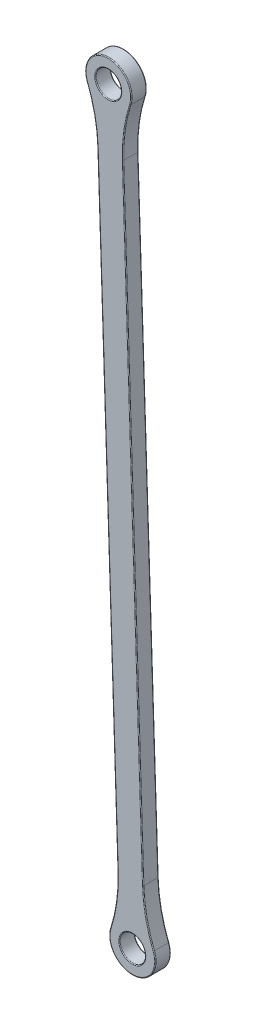
ISO-10303-21;
HEADER;
FILE_DESCRIPTION(('STEP AP214'),'2;1');
FILE_NAME('part.step','',(''),(''),'','','');
FILE_SCHEMA(('AUTOMOTIVE_DESIGN { 1 0 10303 214 1 1 1 1 }'));
ENDSEC;
DATA;
#1=APPLICATION_CONTEXT('core data for automotive mechanical design processes');
#2=APPLICATION_PROTOCOL_DEFINITION('international standard','automotive_design',2000,#1);
#3=PRODUCT_CONTEXT('',#1,'mechanical');
#4=PRODUCT('Part','Part','',(#3));
#5=PRODUCT_RELATED_PRODUCT_CATEGORY('part','',(#4));
#6=PRODUCT_DEFINITION_FORMATION('','',#4);
#7=PRODUCT_DEFINITION_CONTEXT('part definition',#1,'design');
#8=PRODUCT_DEFINITION('design','',#6,#7);
#9=PRODUCT_DEFINITION_SHAPE('','',#8);
#10=(LENGTH_UNIT() NAMED_UNIT(*) SI_UNIT(.MILLI.,.METRE.));
#11=(NAMED_UNIT(*) PLANE_ANGLE_UNIT() SI_UNIT($,.RADIAN.));
#12=(NAMED_UNIT(*) SI_UNIT($,.STERADIAN.) SOLID_ANGLE_UNIT());
#13=UNCERTAINTY_MEASURE_WITH_UNIT(LENGTH_MEASURE(1.E-05),#10,'distance_accuracy_value','');
#14=(GEOMETRIC_REPRESENTATION_CONTEXT(3) GLOBAL_UNCERTAINTY_ASSIGNED_CONTEXT((#13)) GLOBAL_UNIT_ASSIGNED_CONTEXT((#10,
#11,#12)) REPRESENTATION_CONTEXT('',''));
#15=CARTESIAN_POINT('',(0.,0.,0.));
#16=DIRECTION('',(0.,0.,1.));
#17=DIRECTION('',(1.,0.,0.));
#18=AXIS2_PLACEMENT_3D('',#15,#16,#17);
#19=CARTESIAN_POINT('',(12.6423078714266,0.412332992630921,-3.));
#20=DIRECTION('',(0.999468544223204,0.032597992397532,0.));
#21=DIRECTION('',(-0.032597992397532,0.999468544223204,0.));
#22=AXIS2_PLACEMENT_3D('',#19,#20,#21);
#23=PLANE('',#22);
#24=DIRECTION('',(0.,0.,-1.));
#25=VECTOR('',#24,1.);
#26=CARTESIAN_POINT('',(5.68734340622255,213.654551236962,-3.));
#27=LINE('',#26,#25);
#28=CARTESIAN_POINT('',(5.68734340622255,213.654551236962,-0.15));
#29=VERTEX_POINT('',#28);
#30=CARTESIAN_POINT('',(5.68734340622255,213.654551236962,-2.85));
#31=VERTEX_POINT('',#30);
#32=EDGE_CURVE('E315',#29,#31,#27,.T.);
#33=ORIENTED_EDGE('',*,*,#32,.T.);
#34=DIRECTION('',(-0.032597992397532,0.999468544223204,0.));
#35=VECTOR('',#34,1.);
#36=CARTESIAN_POINT('',(12.6423078714266,0.412332992630921,-2.85));
#37=LINE('',#36,#35);
#38=CARTESIAN_POINT('',(9.62504250764336,92.9229938916081,-2.85));
#39=VERTEX_POINT('',#38);
#40=EDGE_CURVE('E284',#31,#39,#37,.F.);
#41=ORIENTED_EDGE('',*,*,#40,.T.);
#42=DIRECTION('',(0.,0.,1.));
#43=VECTOR('',#42,1.);
#44=CARTESIAN_POINT('',(9.62504250764336,92.9229938916081,-3.));
#45=LINE('',#44,#43);
#46=CARTESIAN_POINT('',(9.62504250764336,92.9229938916081,-0.15));
#47=VERTEX_POINT('',#46);
#48=EDGE_CURVE('E318',#39,#47,#45,.T.);
#49=ORIENTED_EDGE('',*,*,#48,.T.);
#50=DIRECTION('',(-0.032597992397532,0.999468544223204,0.));
#51=VECTOR('',#50,1.);
#52=CARTESIAN_POINT('',(5.68734340622256,213.654551236962,-0.15));
#53=LINE('',#52,#51);
#54=EDGE_CURVE('E287',#47,#29,#53,.T.);
#55=ORIENTED_EDGE('',*,*,#54,.T.);
#56=EDGE_LOOP('',(#33,#41,#49,#55));
#57=FACE_BOUND('',#56,.T.);
#58=ADVANCED_FACE('F35',(#57),#23,.F.);
#59=CARTESIAN_POINT('',(7.80866572342832,225.305731075353,-3.));
#60=DIRECTION('',(0.,0.,1.));
#61=DIRECTION('',(1.,0.,0.));
#62=AXIS2_PLACEMENT_3D('',#59,#60,#61);
#63=CYLINDRICAL_SURFACE('',#62,4.50000000000002);
#64=DIRECTION('',(0.,0.,1.));
#65=VECTOR('',#64,1.);
#66=CARTESIAN_POINT('',(3.6210076394411,223.658454604442,-3.));
#67=LINE('',#66,#65);
#68=CARTESIAN_POINT('',(3.6210076394411,223.658454604442,-2.85));
#69=VERTEX_POINT('',#68);
#70=CARTESIAN_POINT('',(3.6210076394411,223.658454604442,-0.15));
#71=VERTEX_POINT('',#70);
#72=EDGE_CURVE('E321',#69,#71,#67,.T.);
#73=ORIENTED_EDGE('',*,*,#72,.T.);
#74=CARTESIAN_POINT('',(7.80866572342832,225.305731075353,-0.15));
#75=DIRECTION('',(0.,0.,1.));
#76=DIRECTION('',(1.,0.,0.));
#77=AXIS2_PLACEMENT_3D('',#74,#75,#76);
#78=CIRCLE('',#77,4.50000000000002);
#79=CARTESIAN_POINT('',(12.09476268829,223.934828887813,-0.15));
#80=VERTEX_POINT('',#79);
#81=EDGE_CURVE('E58',#71,#80,#78,.F.);
#82=ORIENTED_EDGE('',*,*,#81,.T.);
#83=DIRECTION('',(0.,0.,1.));
#84=VECTOR('',#83,1.);
#85=CARTESIAN_POINT('',(12.09476268829,223.934828887813,-3.));
#86=LINE('',#85,#84);
#87=CARTESIAN_POINT('',(12.09476268829,223.934828887813,-2.85));
#88=VERTEX_POINT('',#87);
#89=EDGE_CURVE('E195',#80,#88,#86,.F.);
#90=ORIENTED_EDGE('',*,*,#89,.T.);
#91=CARTESIAN_POINT('',(7.80866572342832,225.305731075353,-2.85));
#92=DIRECTION('',(0.,0.,1.));
#93=DIRECTION('',(1.,0.,0.));
#94=AXIS2_PLACEMENT_3D('',#91,#92,#93);
#95=CIRCLE('',#94,4.50000000000002);
#96=EDGE_CURVE('E227',#88,#69,#95,.T.);
#97=ORIENTED_EDGE('',*,*,#96,.T.);
#98=EDGE_LOOP('',(#73,#82,#90,#97));
#99=FACE_BOUND('',#98,.T.);
#100=ADVANCED_FACE('F323',(#99),#63,.T.);
#101=CARTESIAN_POINT('',(17.6396505925427,0.575322954618585,-3.));
#102=DIRECTION('',(0.999468544223204,0.0325979923975322,0.));
#103=DIRECTION('',(-0.0325979923975322,0.999468544223204,0.));
#104=AXIS2_PLACEMENT_3D('',#101,#102,#103);
#105=PLANE('',#104);
#106=DIRECTION('',(0.,0.,-1.));
#107=VECTOR('',#106,1.);
#108=CARTESIAN_POINT('',(14.6223852287594,93.0859838535957,-3.));
#109=LINE('',#108,#107);
#110=CARTESIAN_POINT('',(14.6223852287594,93.0859838535957,-0.15));
#111=VERTEX_POINT('',#110);
#112=CARTESIAN_POINT('',(14.6223852287594,93.0859838535957,-2.85));
#113=VERTEX_POINT('',#112);
#114=EDGE_CURVE('E312',#111,#113,#109,.T.);
#115=ORIENTED_EDGE('',*,*,#114,.T.);
#116=DIRECTION('',(-0.0325979923975322,0.999468544223204,0.));
#117=VECTOR('',#116,1.);
#118=CARTESIAN_POINT('',(10.6846861273386,213.81754119895,-2.85));
#119=LINE('',#118,#117);
#120=CARTESIAN_POINT('',(10.6846861273386,213.81754119895,-2.85));
#121=VERTEX_POINT('',#120);
#122=EDGE_CURVE('E268',#113,#121,#119,.T.);
#123=ORIENTED_EDGE('',*,*,#122,.T.);
#124=DIRECTION('',(0.,0.,1.));
#125=VECTOR('',#124,1.);
#126=CARTESIAN_POINT('',(10.6846861273386,213.81754119895,-3.));
#127=LINE('',#126,#125);
#128=CARTESIAN_POINT('',(10.6846861273386,213.81754119895,-0.15));
#129=VERTEX_POINT('',#128);
#130=EDGE_CURVE('E309',#121,#129,#127,.T.);
#131=ORIENTED_EDGE('',*,*,#130,.T.);
#132=DIRECTION('',(-0.0325979923975322,0.999468544223204,0.));
#133=VECTOR('',#132,1.);
#134=CARTESIAN_POINT('',(17.6396505925427,0.575322954618585,-0.15));
#135=LINE('',#134,#133);
#136=EDGE_CURVE('E270',#129,#111,#135,.F.);
#137=ORIENTED_EDGE('',*,*,#136,.T.);
#138=EDGE_LOOP('',(#115,#123,#131,#137));
#139=FACE_BOUND('',#138,.T.);
#140=ADVANCED_FACE('F368',(#139),#105,.T.);
#141=CARTESIAN_POINT('',(7.80866572342832,225.305731075353,-3.));
#142=DIRECTION('',(0.,0.,1.));
#143=DIRECTION('',(1.,0.,0.));
#144=AXIS2_PLACEMENT_3D('',#141,#142,#143);
#145=CYLINDRICAL_SURFACE('',#144,2.5);
#146=CARTESIAN_POINT('',(7.80866572342832,225.305731075353,-2.85));
#147=DIRECTION('',(0.,0.,1.));
#148=DIRECTION('',(1.,0.,0.));
#149=AXIS2_PLACEMENT_3D('',#146,#147,#148);
#150=CIRCLE('',#149,2.5);
#151=CARTESIAN_POINT('',(10.3086657234283,225.305731075353,-2.85));
#152=VERTEX_POINT('',#151);
#153=EDGE_CURVE('E262',#152,#152,#150,.F.);
#154=ORIENTED_EDGE('',*,*,#153,.T.);
#155=EDGE_LOOP('',(#154));
#156=FACE_BOUND('',#155,.T.);
#157=CARTESIAN_POINT('',(7.80866572342832,225.305731075353,-0.15));
#158=DIRECTION('',(0.,0.,1.));
#159=DIRECTION('',(1.,0.,0.));
#160=AXIS2_PLACEMENT_3D('',#157,#158,#159);
#161=CIRCLE('',#160,2.5);
#162=CARTESIAN_POINT('',(10.3086657234283,225.305731075353,-0.15));
#163=VERTEX_POINT('',#162);
#164=EDGE_CURVE('E265',#163,#163,#161,.T.);
#165=ORIENTED_EDGE('',*,*,#164,.T.);
#166=EDGE_LOOP('',(#165));
#167=FACE_BOUND('',#166,.T.);
#168=ADVANCED_FACE('F556',(#156,#167),#145,.F.);
#169=CARTESIAN_POINT('',(12.5010629115536,81.4348040152049,-3.));
#170=DIRECTION('',(0.,0.,1.));
#171=DIRECTION('',(1.,0.,0.));
#172=AXIS2_PLACEMENT_3D('',#169,#170,#171);
#173=CYLINDRICAL_SURFACE('',#172,4.50000000000001);
#174=DIRECTION('',(0.,0.,1.));
#175=VECTOR('',#174,1.);
#176=CARTESIAN_POINT('',(8.21496594669189,82.8057062027454,-3.));
#177=LINE('',#176,#175);
#178=CARTESIAN_POINT('',(8.21496594669189,82.8057062027454,-0.15));
#179=VERTEX_POINT('',#178);
#180=CARTESIAN_POINT('',(8.21496594669189,82.8057062027454,-2.85));
#181=VERTEX_POINT('',#180);
#182=EDGE_CURVE('E172',#179,#181,#177,.F.);
#183=ORIENTED_EDGE('',*,*,#182,.T.);
#184=CARTESIAN_POINT('',(12.5010629115536,81.4348040152049,-2.85));
#185=DIRECTION('',(0.,0.,1.));
#186=DIRECTION('',(1.,0.,0.));
#187=AXIS2_PLACEMENT_3D('',#184,#185,#186);
#188=CIRCLE('',#187,4.50000000000001);
#189=CARTESIAN_POINT('',(16.6887209955408,83.0820804861158,-2.85));
#190=VERTEX_POINT('',#189);
#191=EDGE_CURVE('E276',#181,#190,#188,.T.);
#192=ORIENTED_EDGE('',*,*,#191,.T.);
#193=DIRECTION('',(0.,0.,1.));
#194=VECTOR('',#193,1.);
#195=CARTESIAN_POINT('',(16.6887209955408,83.0820804861158,-3.));
#196=LINE('',#195,#194);
#197=CARTESIAN_POINT('',(16.6887209955408,83.0820804861158,-0.15));
#198=VERTEX_POINT('',#197);
#199=EDGE_CURVE('E306',#190,#198,#196,.T.);
#200=ORIENTED_EDGE('',*,*,#199,.T.);
#201=CARTESIAN_POINT('',(12.5010629115536,81.4348040152049,-0.15));
#202=DIRECTION('',(0.,0.,1.));
#203=DIRECTION('',(1.,0.,0.));
#204=AXIS2_PLACEMENT_3D('',#201,#202,#203);
#205=CIRCLE('',#204,4.50000000000001);
#206=EDGE_CURVE('E278',#198,#179,#205,.F.);
#207=ORIENTED_EDGE('',*,*,#206,.T.);
#208=EDGE_LOOP('',(#183,#192,#200,#207));
#209=FACE_BOUND('',#208,.T.);
#210=ADVANCED_FACE('F372',(#209),#173,.T.);
#211=CARTESIAN_POINT('',(12.5010629115536,81.4348040152049,-3.));
#212=DIRECTION('',(0.,0.,1.));
#213=DIRECTION('',(1.,0.,0.));
#214=AXIS2_PLACEMENT_3D('',#211,#212,#213);
#215=CYLINDRICAL_SURFACE('',#214,2.50000000000001);
#216=CARTESIAN_POINT('',(12.5010629115536,81.4348040152049,-2.85));
#217=DIRECTION('',(0.,0.,1.));
#218=DIRECTION('',(1.,0.,0.));
#219=AXIS2_PLACEMENT_3D('',#216,#217,#218);
#220=CIRCLE('',#219,2.50000000000001);
#221=CARTESIAN_POINT('',(15.0010629115536,81.4348040152049,-2.85));
#222=VERTEX_POINT('',#221);
#223=EDGE_CURVE('E256',#222,#222,#220,.F.);
#224=ORIENTED_EDGE('',*,*,#223,.T.);
#225=EDGE_LOOP('',(#224));
#226=FACE_BOUND('',#225,.T.);
#227=CARTESIAN_POINT('',(12.5010629115536,81.4348040152049,-0.15));
#228=DIRECTION('',(0.,0.,1.));
#229=DIRECTION('',(1.,0.,0.));
#230=AXIS2_PLACEMENT_3D('',#227,#228,#229);
#231=CIRCLE('',#230,2.50000000000001);
#232=CARTESIAN_POINT('',(15.0010629115536,81.4348040152049,-0.15));
#233=VERTEX_POINT('',#232);
#234=EDGE_CURVE('E259',#233,#233,#231,.T.);
#235=ORIENTED_EDGE('',*,*,#234,.T.);
#236=EDGE_LOOP('',(#235));
#237=FACE_BOUND('',#236,.T.);
#238=ADVANCED_FACE('F564',(#226,#237),#215,.F.);
#239=CARTESIAN_POINT('',(0.,0.,-3.));
#240=DIRECTION('',(0.,0.,1.));
#241=DIRECTION('',(1.,0.,0.));
#242=AXIS2_PLACEMENT_3D('',#239,#240,#241);
#243=PLANE('',#242);
#244=CARTESIAN_POINT('',(7.80866572342832,225.305731075353,-3.));
#245=DIRECTION('',(0.,0.,1.));
#246=DIRECTION('',(1.,0.,0.));
#247=AXIS2_PLACEMENT_3D('',#244,#245,#246);
#248=CIRCLE('',#247,2.65);
#249=CARTESIAN_POINT('',(10.4586657234283,225.305731075353,-3.));
#250=VERTEX_POINT('',#249);
#251=EDGE_CURVE('E289',#250,#250,#248,.T.);
#252=ORIENTED_EDGE('',*,*,#251,.T.);
#253=EDGE_LOOP('',(#252));
#254=FACE_BOUND('',#253,.T.);
#255=CARTESIAN_POINT('',(12.5010629115536,81.4348040152049,-3.));
#256=DIRECTION('',(0.,0.,1.));
#257=DIRECTION('',(1.,0.,0.));
#258=AXIS2_PLACEMENT_3D('',#255,#256,#257);
#259=CIRCLE('',#258,2.65000000000001);
#260=CARTESIAN_POINT('',(15.1510629115536,81.4348040152049,-3.));
#261=VERTEX_POINT('',#260);
#262=EDGE_CURVE('E292',#261,#261,#259,.T.);
#263=ORIENTED_EDGE('',*,*,#262,.T.);
#264=EDGE_LOOP('',(#263));
#265=FACE_BOUND('',#264,.T.);
#266=CARTESIAN_POINT('',(-20.3590138190527,91.9450541196822,-3.));
#267=DIRECTION('',(0.,0.,1.));
#268=DIRECTION('',(1.,0.,0.));
#269=AXIS2_PLACEMENT_3D('',#266,#267,#268);
#270=CIRCLE('',#269,30.15);
#271=CARTESIAN_POINT('',(8.35783584552061,82.7600094631607,-3.));
#272=VERTEX_POINT('',#271);
#273=CARTESIAN_POINT('',(9.77496278927685,92.9278835904678,-3.));
#274=VERTEX_POINT('',#273);
#275=EDGE_CURVE('E296',#272,#274,#270,.T.);
#276=ORIENTED_EDGE('',*,*,#275,.T.);
#277=DIRECTION('',(-0.032597992397532,0.999468544223204,0.));
#278=VECTOR('',#277,1.);
#279=CARTESIAN_POINT('',(12.7922281530601,0.41722269149055,-3.));
#280=LINE('',#279,#278);
#281=CARTESIAN_POINT('',(5.83726368785605,213.659440935822,-3.));
#282=VERTEX_POINT('',#281);
#283=EDGE_CURVE('E156',#274,#282,#280,.T.);
#284=ORIENTED_EDGE('',*,*,#283,.T.);
#285=CARTESIAN_POINT('',(-24.2967129204735,212.676611465036,-3.));
#286=DIRECTION('',(0.,0.,1.));
#287=DIRECTION('',(1.,0.,0.));
#288=AXIS2_PLACEMENT_3D('',#285,#286,#287);
#289=CIRCLE('',#288,30.15);
#290=CARTESIAN_POINT('',(3.76059624224068,223.713363820139,-3.));
#291=VERTEX_POINT('',#290);
#292=EDGE_CURVE('E150',#282,#291,#289,.T.);
#293=ORIENTED_EDGE('',*,*,#292,.T.);
#294=CARTESIAN_POINT('',(7.80866572342832,225.305731075353,-3.));
#295=DIRECTION('',(0.,0.,1.));
#296=DIRECTION('',(1.,0.,0.));
#297=AXIS2_PLACEMENT_3D('',#294,#295,#296);
#298=CIRCLE('',#297,4.35000000000002);
#299=CARTESIAN_POINT('',(11.9518927894613,223.980525627398,-3.));
#300=VERTEX_POINT('',#299);
#301=EDGE_CURVE('E153',#291,#300,#298,.F.);
#302=ORIENTED_EDGE('',*,*,#301,.T.);
#303=CARTESIAN_POINT('',(40.6687424540347,214.795480970876,-3.));
#304=DIRECTION('',(0.,0.,1.));
#305=DIRECTION('',(1.,0.,0.));
#306=AXIS2_PLACEMENT_3D('',#303,#304,#305);
#307=CIRCLE('',#306,30.15);
#308=CARTESIAN_POINT('',(10.5347658457051,213.812651500091,-3.));
#309=VERTEX_POINT('',#308);
#310=EDGE_CURVE('E161',#300,#309,#307,.T.);
#311=ORIENTED_EDGE('',*,*,#310,.T.);
#312=DIRECTION('',(-0.0325979923975322,0.999468544223204,0.));
#313=VECTOR('',#312,1.);
#314=CARTESIAN_POINT('',(14.4724649471259,93.0810941547361,-3.));
#315=LINE('',#314,#313);
#316=CARTESIAN_POINT('',(14.4724649471259,93.0810941547361,-3.));
#317=VERTEX_POINT('',#316);
#318=EDGE_CURVE('E160',#309,#317,#315,.F.);
#319=ORIENTED_EDGE('',*,*,#318,.T.);
#320=CARTESIAN_POINT('',(44.6064415554555,94.0639236255217,-3.));
#321=DIRECTION('',(0.,0.,1.));
#322=DIRECTION('',(1.,0.,0.));
#323=AXIS2_PLACEMENT_3D('',#320,#321,#322);
#324=CIRCLE('',#323,30.15);
#325=CARTESIAN_POINT('',(16.5491323927412,83.0271712704188,-3.));
#326=VERTEX_POINT('',#325);
#327=EDGE_CURVE('E300',#317,#326,#324,.T.);
#328=ORIENTED_EDGE('',*,*,#327,.T.);
#329=CARTESIAN_POINT('',(12.5010629115536,81.4348040152049,-3.));
#330=DIRECTION('',(0.,0.,1.));
#331=DIRECTION('',(1.,0.,0.));
#332=AXIS2_PLACEMENT_3D('',#329,#330,#331);
#333=CIRCLE('',#332,4.35000000000001);
#334=EDGE_CURVE('E298',#326,#272,#333,.F.);
#335=ORIENTED_EDGE('',*,*,#334,.T.);
#336=EDGE_LOOP('',(#276,#284,#293,#302,#311,#319,#328,#335));
#337=FACE_BOUND('',#336,.T.);
#338=ADVANCED_FACE('F152',(#254,#265,#337),#243,.F.);
#339=CARTESIAN_POINT('',(0.,0.,0.));
#340=DIRECTION('',(0.,0.,1.));
#341=DIRECTION('',(1.,0.,0.));
#342=AXIS2_PLACEMENT_3D('',#339,#340,#341);
#343=PLANE('',#342);
#344=CARTESIAN_POINT('',(12.5010629115536,81.4348040152049,0.));
#345=DIRECTION('',(0.,0.,1.));
#346=DIRECTION('',(1.,0.,0.));
#347=AXIS2_PLACEMENT_3D('',#344,#345,#346);
#348=CIRCLE('',#347,2.65000000000001);
#349=CARTESIAN_POINT('',(15.1510629115536,81.4348040152049,0.));
#350=VERTEX_POINT('',#349);
#351=EDGE_CURVE('E233',#350,#350,#348,.F.);
#352=ORIENTED_EDGE('',*,*,#351,.T.);
#353=EDGE_LOOP('',(#352));
#354=FACE_BOUND('',#353,.T.);
#355=CARTESIAN_POINT('',(7.80866572342832,225.305731075353,0.));
#356=DIRECTION('',(0.,0.,1.));
#357=DIRECTION('',(1.,0.,0.));
#358=AXIS2_PLACEMENT_3D('',#355,#356,#357);
#359=CIRCLE('',#358,2.65);
#360=CARTESIAN_POINT('',(10.4586657234283,225.305731075353,0.));
#361=VERTEX_POINT('',#360);
#362=EDGE_CURVE('E236',#361,#361,#359,.F.);
#363=ORIENTED_EDGE('',*,*,#362,.T.);
#364=EDGE_LOOP('',(#363));
#365=FACE_BOUND('',#364,.T.);
#366=CARTESIAN_POINT('',(40.6687424540347,214.795480970876,0.));
#367=DIRECTION('',(0.,0.,1.));
#368=DIRECTION('',(1.,0.,0.));
#369=AXIS2_PLACEMENT_3D('',#366,#367,#368);
#370=CIRCLE('',#369,30.15);
#371=CARTESIAN_POINT('',(10.5347658457051,213.812651500091,0.));
#372=VERTEX_POINT('',#371);
#373=CARTESIAN_POINT('',(11.9518927894613,223.980525627398,0.));
#374=VERTEX_POINT('',#373);
#375=EDGE_CURVE('E241',#372,#374,#370,.F.);
#376=ORIENTED_EDGE('',*,*,#375,.T.);
#377=CARTESIAN_POINT('',(7.80866572342832,225.305731075353,0.));
#378=DIRECTION('',(0.,0.,1.));
#379=DIRECTION('',(1.,0.,0.));
#380=AXIS2_PLACEMENT_3D('',#377,#378,#379);
#381=CIRCLE('',#380,4.35000000000002);
#382=CARTESIAN_POINT('',(3.76059624224068,223.713363820139,0.));
#383=VERTEX_POINT('',#382);
#384=EDGE_CURVE('E239',#374,#383,#381,.T.);
#385=ORIENTED_EDGE('',*,*,#384,.T.);
#386=CARTESIAN_POINT('',(-24.2967129204735,212.676611465036,0.));
#387=DIRECTION('',(0.,0.,1.));
#388=DIRECTION('',(1.,0.,0.));
#389=AXIS2_PLACEMENT_3D('',#386,#387,#388);
#390=CIRCLE('',#389,30.15);
#391=CARTESIAN_POINT('',(5.83726368785604,213.659440935822,0.));
#392=VERTEX_POINT('',#391);
#393=EDGE_CURVE('E247',#383,#392,#390,.F.);
#394=ORIENTED_EDGE('',*,*,#393,.T.);
#395=DIRECTION('',(-0.032597992397532,0.999468544223204,0.));
#396=VECTOR('',#395,1.);
#397=CARTESIAN_POINT('',(9.77496278927684,92.9278835904678,0.));
#398=LINE('',#397,#396);
#399=CARTESIAN_POINT('',(9.77496278927685,92.9278835904678,0.));
#400=VERTEX_POINT('',#399);
#401=EDGE_CURVE('E250',#392,#400,#398,.F.);
#402=ORIENTED_EDGE('',*,*,#401,.T.);
#403=CARTESIAN_POINT('',(-20.3590138190527,91.9450541196822,0.));
#404=DIRECTION('',(0.,0.,1.));
#405=DIRECTION('',(1.,0.,0.));
#406=AXIS2_PLACEMENT_3D('',#403,#404,#405);
#407=CIRCLE('',#406,30.15);
#408=CARTESIAN_POINT('',(8.35783584552062,82.7600094631607,0.));
#409=VERTEX_POINT('',#408);
#410=EDGE_CURVE('E254',#400,#409,#407,.F.);
#411=ORIENTED_EDGE('',*,*,#410,.T.);
#412=CARTESIAN_POINT('',(12.5010629115536,81.4348040152049,0.));
#413=DIRECTION('',(0.,0.,1.));
#414=DIRECTION('',(1.,0.,0.));
#415=AXIS2_PLACEMENT_3D('',#412,#413,#414);
#416=CIRCLE('',#415,4.35000000000001);
#417=CARTESIAN_POINT('',(16.5491323927412,83.0271712704188,0.));
#418=VERTEX_POINT('',#417);
#419=EDGE_CURVE('E252',#409,#418,#416,.T.);
#420=ORIENTED_EDGE('',*,*,#419,.T.);
#421=CARTESIAN_POINT('',(44.6064415554555,94.0639236255217,0.));
#422=DIRECTION('',(0.,0.,1.));
#423=DIRECTION('',(1.,0.,0.));
#424=AXIS2_PLACEMENT_3D('',#421,#422,#423);
#425=CIRCLE('',#424,30.15);
#426=CARTESIAN_POINT('',(14.4724649471259,93.0810941547361,0.));
#427=VERTEX_POINT('',#426);
#428=EDGE_CURVE('E245',#418,#427,#425,.F.);
#429=ORIENTED_EDGE('',*,*,#428,.T.);
#430=DIRECTION('',(-0.0325979923975322,0.999468544223204,0.));
#431=VECTOR('',#430,1.);
#432=CARTESIAN_POINT('',(17.4897303109092,0.570433255758956,0.));
#433=LINE('',#432,#431);
#434=EDGE_CURVE('E243',#427,#372,#433,.T.);
#435=ORIENTED_EDGE('',*,*,#434,.T.);
#436=EDGE_LOOP('',(#376,#385,#394,#402,#411,#420,#429,#435));
#437=FACE_BOUND('',#436,.T.);
#438=ADVANCED_FACE('F378',(#354,#365,#437),#343,.T.);
#439=CARTESIAN_POINT('',(-24.2967129204735,212.676611465036,-3.));
#440=DIRECTION('',(0.,0.,1.));
#441=DIRECTION('',(1.,0.,0.));
#442=AXIS2_PLACEMENT_3D('',#439,#440,#441);
#443=CYLINDRICAL_SURFACE('',#442,30.);
#444=ORIENTED_EDGE('',*,*,#32,.F.);
#445=CARTESIAN_POINT('',(-24.2967129204735,212.676611465036,-0.15));
#446=DIRECTION('',(0.,0.,1.));
#447=DIRECTION('',(1.,0.,0.));
#448=AXIS2_PLACEMENT_3D('',#445,#446,#447);
#449=CIRCLE('',#448,30.);
#450=EDGE_CURVE('E229',#29,#71,#449,.T.);
#451=ORIENTED_EDGE('',*,*,#450,.T.);
#452=ORIENTED_EDGE('',*,*,#72,.F.);
#453=CARTESIAN_POINT('',(-24.2967129204735,212.676611465036,-2.85));
#454=DIRECTION('',(0.,0.,1.));
#455=DIRECTION('',(1.,0.,0.));
#456=AXIS2_PLACEMENT_3D('',#453,#454,#455);
#457=CIRCLE('',#456,30.);
#458=EDGE_CURVE('E175',#69,#31,#457,.F.);
#459=ORIENTED_EDGE('',*,*,#458,.T.);
#460=EDGE_LOOP('',(#444,#451,#452,#459));
#461=FACE_BOUND('',#460,.T.);
#462=ADVANCED_FACE('F374',(#461),#443,.F.);
#463=CARTESIAN_POINT('',(40.6687424540347,214.795480970876,-3.));
#464=DIRECTION('',(0.,0.,1.));
#465=DIRECTION('',(1.,0.,0.));
#466=AXIS2_PLACEMENT_3D('',#463,#464,#465);
#467=CYLINDRICAL_SURFACE('',#466,30.);
#468=ORIENTED_EDGE('',*,*,#89,.F.);
#469=CARTESIAN_POINT('',(40.6687424540347,214.795480970876,-0.15));
#470=DIRECTION('',(0.,0.,1.));
#471=DIRECTION('',(1.,0.,0.));
#472=AXIS2_PLACEMENT_3D('',#469,#470,#471);
#473=CIRCLE('',#472,30.);
#474=EDGE_CURVE('E11',#80,#129,#473,.T.);
#475=ORIENTED_EDGE('',*,*,#474,.T.);
#476=ORIENTED_EDGE('',*,*,#130,.F.);
#477=CARTESIAN_POINT('',(40.6687424540347,214.795480970876,-2.85));
#478=DIRECTION('',(0.,0.,1.));
#479=DIRECTION('',(1.,0.,0.));
#480=AXIS2_PLACEMENT_3D('',#477,#478,#479);
#481=CIRCLE('',#480,30.);
#482=EDGE_CURVE('E44',#121,#88,#481,.F.);
#483=ORIENTED_EDGE('',*,*,#482,.T.);
#484=EDGE_LOOP('',(#468,#475,#476,#483));
#485=FACE_BOUND('',#484,.T.);
#486=ADVANCED_FACE('F377',(#485),#467,.F.);
#487=CARTESIAN_POINT('',(-20.3590138190527,91.9450541196822,-3.));
#488=DIRECTION('',(0.,0.,1.));
#489=DIRECTION('',(1.,0.,0.));
#490=AXIS2_PLACEMENT_3D('',#487,#488,#489);
#491=CYLINDRICAL_SURFACE('',#490,30.);
#492=ORIENTED_EDGE('',*,*,#48,.F.);
#493=CARTESIAN_POINT('',(-20.3590138190527,91.9450541196822,-2.85));
#494=DIRECTION('',(0.,0.,1.));
#495=DIRECTION('',(1.,0.,0.));
#496=AXIS2_PLACEMENT_3D('',#493,#494,#495);
#497=CIRCLE('',#496,30.);
#498=EDGE_CURVE('E280',#39,#181,#497,.F.);
#499=ORIENTED_EDGE('',*,*,#498,.T.);
#500=ORIENTED_EDGE('',*,*,#182,.F.);
#501=CARTESIAN_POINT('',(-20.3590138190527,91.9450541196822,-0.15));
#502=DIRECTION('',(0.,0.,1.));
#503=DIRECTION('',(1.,0.,0.));
#504=AXIS2_PLACEMENT_3D('',#501,#502,#503);
#505=CIRCLE('',#504,30.);
#506=EDGE_CURVE('E282',#179,#47,#505,.T.);
#507=ORIENTED_EDGE('',*,*,#506,.T.);
#508=EDGE_LOOP('',(#492,#499,#500,#507));
#509=FACE_BOUND('',#508,.T.);
#510=ADVANCED_FACE('F382',(#509),#491,.F.);
#511=CARTESIAN_POINT('',(44.6064415554555,94.0639236255217,-3.));
#512=DIRECTION('',(0.,0.,1.));
#513=DIRECTION('',(1.,0.,0.));
#514=AXIS2_PLACEMENT_3D('',#511,#512,#513);
#515=CYLINDRICAL_SURFACE('',#514,30.);
#516=ORIENTED_EDGE('',*,*,#199,.F.);
#517=CARTESIAN_POINT('',(44.6064415554555,94.0639236255217,-2.85));
#518=DIRECTION('',(0.,0.,1.));
#519=DIRECTION('',(1.,0.,0.));
#520=AXIS2_PLACEMENT_3D('',#517,#518,#519);
#521=CIRCLE('',#520,30.);
#522=EDGE_CURVE('E272',#190,#113,#521,.F.);
#523=ORIENTED_EDGE('',*,*,#522,.T.);
#524=ORIENTED_EDGE('',*,*,#114,.F.);
#525=CARTESIAN_POINT('',(44.6064415554555,94.0639236255217,-0.15));
#526=DIRECTION('',(0.,0.,1.));
#527=DIRECTION('',(1.,0.,0.));
#528=AXIS2_PLACEMENT_3D('',#525,#526,#527);
#529=CIRCLE('',#528,30.);
#530=EDGE_CURVE('E274',#111,#198,#529,.T.);
#531=ORIENTED_EDGE('',*,*,#530,.T.);
#532=EDGE_LOOP('',(#516,#523,#524,#531));
#533=FACE_BOUND('',#532,.T.);
#534=ADVANCED_FACE('F384',(#533),#515,.F.);
#535=CARTESIAN_POINT('',(17.4897303109092,0.570433255758955,-2.85));
#536=DIRECTION('',(0.0325979923975322,-0.999468544223204,0.));
#537=DIRECTION('',(0.999468544223204,0.0325979923975322,0.));
#538=AXIS2_PLACEMENT_3D('',#535,#536,#537);
#539=CYLINDRICAL_SURFACE('',#538,0.15);
#540=CARTESIAN_POINT('',(10.5347658457051,213.812651500091,-2.85));
#541=DIRECTION('',(-0.0325979923974468,0.999468544223207,0.));
#542=DIRECTION('',(-0.999468544223207,-0.0325979923974468,0.));
#543=AXIS2_PLACEMENT_3D('',#540,#541,#542);
#544=CIRCLE('',#543,0.15);
#545=EDGE_CURVE('E189',#121,#309,#544,.T.);
#546=ORIENTED_EDGE('',*,*,#545,.F.);
#547=ORIENTED_EDGE('',*,*,#122,.F.);
#548=CARTESIAN_POINT('',(14.4724649471259,93.0810941547361,-2.85));
#549=DIRECTION('',(0.0325979923975392,-0.999468544223204,0.));
#550=DIRECTION('',(0.999468544223204,0.0325979923975392,0.));
#551=AXIS2_PLACEMENT_3D('',#548,#549,#550);
#552=CIRCLE('',#551,0.15);
#553=EDGE_CURVE('E192',#317,#113,#552,.T.);
#554=ORIENTED_EDGE('',*,*,#553,.F.);
#555=ORIENTED_EDGE('',*,*,#318,.F.);
#556=EDGE_LOOP('',(#546,#547,#554,#555));
#557=FACE_BOUND('',#556,.T.);
#558=ADVANCED_FACE('F332',(#557),#539,.T.);
#559=CARTESIAN_POINT('',(44.6064415554555,94.0639236255217,-2.85));
#560=DIRECTION('',(0.,0.,1.));
#561=DIRECTION('',(1.,0.,0.));
#562=AXIS2_PLACEMENT_3D('',#559,#560,#561);
#563=TOROIDAL_SURFACE('',#562,30.15,0.15);
#564=ORIENTED_EDGE('',*,*,#553,.T.);
#565=ORIENTED_EDGE('',*,*,#522,.F.);
#566=CARTESIAN_POINT('',(16.5491323927412,83.0271712704188,-2.85));
#567=DIRECTION('',(0.366061437980231,-0.930590685330477,0.));
#568=DIRECTION('',(0.930590685330477,0.366061437980231,0.));
#569=AXIS2_PLACEMENT_3D('',#566,#567,#568);
#570=CIRCLE('',#569,0.15);
#571=EDGE_CURVE('E186',#326,#190,#570,.T.);
#572=ORIENTED_EDGE('',*,*,#571,.F.);
#573=ORIENTED_EDGE('',*,*,#327,.F.);
#574=EDGE_LOOP('',(#564,#565,#572,#573));
#575=FACE_BOUND('',#574,.T.);
#576=ADVANCED_FACE('F338',(#575),#563,.T.);
#577=CARTESIAN_POINT('',(40.6687424540347,214.795480970876,-2.85));
#578=DIRECTION('',(0.,0.,1.));
#579=DIRECTION('',(1.,0.,0.));
#580=AXIS2_PLACEMENT_3D('',#577,#578,#579);
#581=TOROIDAL_SURFACE('',#580,30.15,0.15);
#582=ORIENTED_EDGE('',*,*,#545,.T.);
#583=ORIENTED_EDGE('',*,*,#310,.F.);
#584=CARTESIAN_POINT('',(11.9518927894613,223.980525627398,-2.85));
#585=DIRECTION('',(0.304644930564553,0.95246599219149,0.));
#586=DIRECTION('',(-0.95246599219149,0.304644930564553,0.));
#587=AXIS2_PLACEMENT_3D('',#584,#585,#586);
#588=CIRCLE('',#587,0.15);
#589=EDGE_CURVE('E171',#88,#300,#588,.T.);
#590=ORIENTED_EDGE('',*,*,#589,.F.);
#591=ORIENTED_EDGE('',*,*,#482,.F.);
#592=EDGE_LOOP('',(#582,#583,#590,#591));
#593=FACE_BOUND('',#592,.T.);
#594=ADVANCED_FACE('F327',(#593),#581,.T.);
#595=CARTESIAN_POINT('',(12.5010629115536,81.4348040152049,-2.85));
#596=DIRECTION('',(0.,0.,1.));
#597=DIRECTION('',(1.,0.,0.));
#598=AXIS2_PLACEMENT_3D('',#595,#596,#597);
#599=TOROIDAL_SURFACE('',#598,4.35000000000001,0.15);
#600=ORIENTED_EDGE('',*,*,#571,.T.);
#601=ORIENTED_EDGE('',*,*,#191,.F.);
#602=CARTESIAN_POINT('',(8.35783584552061,82.7600094631607,-2.85));
#603=DIRECTION('',(0.304644930564553,0.95246599219149,0.));
#604=DIRECTION('',(-0.95246599219149,0.304644930564553,0.));
#605=AXIS2_PLACEMENT_3D('',#602,#603,#604);
#606=CIRCLE('',#605,0.15);
#607=EDGE_CURVE('E176',#272,#181,#606,.T.);
#608=ORIENTED_EDGE('',*,*,#607,.F.);
#609=ORIENTED_EDGE('',*,*,#334,.F.);
#610=EDGE_LOOP('',(#600,#601,#608,#609));
#611=FACE_BOUND('',#610,.T.);
#612=ADVANCED_FACE('F345',(#611),#599,.T.);
#613=CARTESIAN_POINT('',(7.80866572342832,225.305731075353,-2.85));
#614=DIRECTION('',(0.,0.,1.));
#615=DIRECTION('',(1.,0.,0.));
#616=AXIS2_PLACEMENT_3D('',#613,#614,#615);
#617=TOROIDAL_SURFACE('',#616,4.35000000000002,0.15);
#618=ORIENTED_EDGE('',*,*,#589,.T.);
#619=ORIENTED_EDGE('',*,*,#301,.F.);
#620=CARTESIAN_POINT('',(3.76059624224068,223.713363820139,-2.85));
#621=DIRECTION('',(0.366061437980231,-0.930590685330476,0.));
#622=DIRECTION('',(0.930590685330476,0.366061437980232,0.));
#623=AXIS2_PLACEMENT_3D('',#620,#621,#622);
#624=CIRCLE('',#623,0.15);
#625=EDGE_CURVE('E168',#69,#291,#624,.T.);
#626=ORIENTED_EDGE('',*,*,#625,.F.);
#627=ORIENTED_EDGE('',*,*,#96,.F.);
#628=EDGE_LOOP('',(#618,#619,#626,#627));
#629=FACE_BOUND('',#628,.T.);
#630=ADVANCED_FACE('F166',(#629),#617,.T.);
#631=CARTESIAN_POINT('',(-20.3590138190527,91.9450541196822,-2.85));
#632=DIRECTION('',(0.,0.,1.));
#633=DIRECTION('',(1.,0.,0.));
#634=AXIS2_PLACEMENT_3D('',#631,#632,#633);
#635=TOROIDAL_SURFACE('',#634,30.15,0.15);
#636=ORIENTED_EDGE('',*,*,#607,.T.);
#637=ORIENTED_EDGE('',*,*,#498,.F.);
#638=CARTESIAN_POINT('',(9.77496278927685,92.9278835904678,-2.85));
#639=DIRECTION('',(-0.0325979923975392,0.999468544223204,0.));
#640=DIRECTION('',(-0.999468544223204,-0.0325979923975392,0.));
#641=AXIS2_PLACEMENT_3D('',#638,#639,#640);
#642=CIRCLE('',#641,0.15);
#643=EDGE_CURVE('E177',#274,#39,#642,.T.);
#644=ORIENTED_EDGE('',*,*,#643,.F.);
#645=ORIENTED_EDGE('',*,*,#275,.F.);
#646=EDGE_LOOP('',(#636,#637,#644,#645));
#647=FACE_BOUND('',#646,.T.);
#648=ADVANCED_FACE('F348',(#647),#635,.T.);
#649=CARTESIAN_POINT('',(-24.2967129204735,212.676611465036,-2.85));
#650=DIRECTION('',(0.,0.,1.));
#651=DIRECTION('',(1.,0.,0.));
#652=AXIS2_PLACEMENT_3D('',#649,#650,#651);
#653=TOROIDAL_SURFACE('',#652,30.15,0.15);
#654=ORIENTED_EDGE('',*,*,#625,.T.);
#655=ORIENTED_EDGE('',*,*,#292,.F.);
#656=CARTESIAN_POINT('',(5.83726368785605,213.659440935822,-2.85));
#657=DIRECTION('',(0.0325979923974466,-0.999468544223207,0.));
#658=DIRECTION('',(0.999468544223207,0.0325979923974466,0.));
#659=AXIS2_PLACEMENT_3D('',#656,#657,#658);
#660=CIRCLE('',#659,0.15);
#661=EDGE_CURVE('E181',#31,#282,#660,.T.);
#662=ORIENTED_EDGE('',*,*,#661,.F.);
#663=ORIENTED_EDGE('',*,*,#458,.F.);
#664=EDGE_LOOP('',(#654,#655,#662,#663));
#665=FACE_BOUND('',#664,.T.);
#666=ADVANCED_FACE('F174',(#665),#653,.T.);
#667=CARTESIAN_POINT('',(12.7922281530601,0.41722269149055,-2.85));
#668=DIRECTION('',(-0.032597992397532,0.999468544223204,0.));
#669=DIRECTION('',(-0.999468544223204,-0.032597992397532,0.));
#670=AXIS2_PLACEMENT_3D('',#667,#668,#669);
#671=CYLINDRICAL_SURFACE('',#670,0.15);
#672=ORIENTED_EDGE('',*,*,#643,.T.);
#673=ORIENTED_EDGE('',*,*,#40,.F.);
#674=ORIENTED_EDGE('',*,*,#661,.T.);
#675=ORIENTED_EDGE('',*,*,#283,.F.);
#676=EDGE_LOOP('',(#672,#673,#674,#675));
#677=FACE_BOUND('',#676,.T.);
#678=ADVANCED_FACE('F349',(#677),#671,.T.);
#679=CARTESIAN_POINT('',(7.80866572342832,225.305731075353,-2.85));
#680=DIRECTION('',(0.,0.,1.));
#681=DIRECTION('',(1.,0.,0.));
#682=AXIS2_PLACEMENT_3D('',#679,#680,#681);
#683=TOROIDAL_SURFACE('',#682,2.65,0.15);
#684=ORIENTED_EDGE('',*,*,#153,.F.);
#685=EDGE_LOOP('',(#684));
#686=FACE_BOUND('',#685,.T.);
#687=ORIENTED_EDGE('',*,*,#251,.F.);
#688=EDGE_LOOP('',(#687));
#689=FACE_BOUND('',#688,.T.);
#690=ADVANCED_FACE('F351',(#686,#689),#683,.T.);
#691=CARTESIAN_POINT('',(12.5010629115536,81.4348040152049,-2.85));
#692=DIRECTION('',(0.,0.,1.));
#693=DIRECTION('',(1.,0.,0.));
#694=AXIS2_PLACEMENT_3D('',#691,#692,#693);
#695=TOROIDAL_SURFACE('',#694,2.65000000000001,0.15);
#696=ORIENTED_EDGE('',*,*,#262,.F.);
#697=EDGE_LOOP('',(#696));
#698=FACE_BOUND('',#697,.T.);
#699=ORIENTED_EDGE('',*,*,#223,.F.);
#700=EDGE_LOOP('',(#699));
#701=FACE_BOUND('',#700,.T.);
#702=ADVANCED_FACE('F357',(#698,#701),#695,.T.);
#703=CARTESIAN_POINT('',(12.5010629115536,81.4348040152049,-0.15));
#704=DIRECTION('',(0.,0.,1.));
#705=DIRECTION('',(1.,0.,0.));
#706=AXIS2_PLACEMENT_3D('',#703,#704,#705);
#707=TOROIDAL_SURFACE('',#706,2.65000000000001,0.15);
#708=ORIENTED_EDGE('',*,*,#234,.F.);
#709=EDGE_LOOP('',(#708));
#710=FACE_BOUND('',#709,.T.);
#711=ORIENTED_EDGE('',*,*,#351,.F.);
#712=EDGE_LOOP('',(#711));
#713=FACE_BOUND('',#712,.T.);
#714=ADVANCED_FACE('F437',(#710,#713),#707,.T.);
#715=CARTESIAN_POINT('',(44.6064415554555,94.0639236255217,-0.15));
#716=DIRECTION('',(0.,0.,1.));
#717=DIRECTION('',(1.,0.,0.));
#718=AXIS2_PLACEMENT_3D('',#715,#716,#717);
#719=TOROIDAL_SURFACE('',#718,30.15,0.15);
#720=CARTESIAN_POINT('',(16.5491323927412,83.0271712704188,-0.15));
#721=DIRECTION('',(0.366061437980231,-0.930590685330477,0.));
#722=DIRECTION('',(0.930590685330477,0.366061437980231,0.));
#723=AXIS2_PLACEMENT_3D('',#720,#721,#722);
#724=CIRCLE('',#723,0.15);
#725=EDGE_CURVE('E211',#198,#418,#724,.T.);
#726=ORIENTED_EDGE('',*,*,#725,.F.);
#727=ORIENTED_EDGE('',*,*,#530,.F.);
#728=CARTESIAN_POINT('',(14.4724649471259,93.0810941547361,-0.15));
#729=DIRECTION('',(-0.0325979923975392,0.999468544223204,0.));
#730=DIRECTION('',(-0.999468544223204,-0.0325979923975392,0.));
#731=AXIS2_PLACEMENT_3D('',#728,#729,#730);
#732=CIRCLE('',#731,0.15);
#733=EDGE_CURVE('E39',#427,#111,#732,.T.);
#734=ORIENTED_EDGE('',*,*,#733,.F.);
#735=ORIENTED_EDGE('',*,*,#428,.F.);
#736=EDGE_LOOP('',(#726,#727,#734,#735));
#737=FACE_BOUND('',#736,.T.);
#738=ADVANCED_FACE('F399',(#737),#719,.T.);
#739=CARTESIAN_POINT('',(17.4897303109092,0.570433255758956,-0.15));
#740=DIRECTION('',(-0.0325979923975322,0.999468544223204,0.));
#741=DIRECTION('',(-0.999468544223204,-0.0325979923975322,0.));
#742=AXIS2_PLACEMENT_3D('',#739,#740,#741);
#743=CYLINDRICAL_SURFACE('',#742,0.15);
#744=ORIENTED_EDGE('',*,*,#733,.T.);
#745=ORIENTED_EDGE('',*,*,#136,.F.);
#746=CARTESIAN_POINT('',(10.5347658457051,213.812651500091,-0.15));
#747=DIRECTION('',(-0.0325979923974472,0.999468544223206,0.));
#748=DIRECTION('',(-0.999468544223207,-0.0325979923974472,0.));
#749=AXIS2_PLACEMENT_3D('',#746,#747,#748);
#750=CIRCLE('',#749,0.15);
#751=EDGE_CURVE('E209',#372,#129,#750,.T.);
#752=ORIENTED_EDGE('',*,*,#751,.F.);
#753=ORIENTED_EDGE('',*,*,#434,.F.);
#754=EDGE_LOOP('',(#744,#745,#752,#753));
#755=FACE_BOUND('',#754,.T.);
#756=ADVANCED_FACE('F429',(#755),#743,.T.);
#757=CARTESIAN_POINT('',(12.5010629115536,81.4348040152049,-0.15));
#758=DIRECTION('',(0.,0.,1.));
#759=DIRECTION('',(1.,0.,0.));
#760=AXIS2_PLACEMENT_3D('',#757,#758,#759);
#761=TOROIDAL_SURFACE('',#760,4.35000000000001,0.15);
#762=ORIENTED_EDGE('',*,*,#725,.T.);
#763=ORIENTED_EDGE('',*,*,#419,.F.);
#764=CARTESIAN_POINT('',(8.35783584552061,82.7600094631607,-0.15));
#765=DIRECTION('',(0.304644930564553,0.95246599219149,0.));
#766=DIRECTION('',(-0.95246599219149,0.304644930564553,0.));
#767=AXIS2_PLACEMENT_3D('',#764,#765,#766);
#768=CIRCLE('',#767,0.15);
#769=EDGE_CURVE('E206',#179,#409,#768,.T.);
#770=ORIENTED_EDGE('',*,*,#769,.F.);
#771=ORIENTED_EDGE('',*,*,#206,.F.);
#772=EDGE_LOOP('',(#762,#763,#770,#771));
#773=FACE_BOUND('',#772,.T.);
#774=ADVANCED_FACE('F401',(#773),#761,.T.);
#775=CARTESIAN_POINT('',(40.6687424540347,214.795480970876,-0.15));
#776=DIRECTION('',(0.,0.,1.));
#777=DIRECTION('',(1.,0.,0.));
#778=AXIS2_PLACEMENT_3D('',#775,#776,#777);
#779=TOROIDAL_SURFACE('',#778,30.15,0.15);
#780=ORIENTED_EDGE('',*,*,#751,.T.);
#781=ORIENTED_EDGE('',*,*,#474,.F.);
#782=CARTESIAN_POINT('',(11.9518927894613,223.980525627398,-0.15));
#783=DIRECTION('',(0.304644930564553,0.95246599219149,0.));
#784=DIRECTION('',(-0.95246599219149,0.304644930564553,0.));
#785=AXIS2_PLACEMENT_3D('',#782,#783,#784);
#786=CIRCLE('',#785,0.15);
#787=EDGE_CURVE('E203',#374,#80,#786,.T.);
#788=ORIENTED_EDGE('',*,*,#787,.F.);
#789=ORIENTED_EDGE('',*,*,#375,.F.);
#790=EDGE_LOOP('',(#780,#781,#788,#789));
#791=FACE_BOUND('',#790,.T.);
#792=ADVANCED_FACE('F426',(#791),#779,.T.);
#793=CARTESIAN_POINT('',(-20.3590138190527,91.9450541196822,-0.15));
#794=DIRECTION('',(0.,0.,1.));
#795=DIRECTION('',(1.,0.,0.));
#796=AXIS2_PLACEMENT_3D('',#793,#794,#795);
#797=TOROIDAL_SURFACE('',#796,30.15,0.15);
#798=ORIENTED_EDGE('',*,*,#769,.T.);
#799=ORIENTED_EDGE('',*,*,#410,.F.);
#800=CARTESIAN_POINT('',(9.77496278927685,92.9278835904678,-0.15));
#801=DIRECTION('',(-0.0325979923975392,0.999468544223204,0.));
#802=DIRECTION('',(-0.999468544223204,-0.0325979923975392,0.));
#803=AXIS2_PLACEMENT_3D('',#800,#801,#802);
#804=CIRCLE('',#803,0.15);
#805=EDGE_CURVE('E200',#47,#400,#804,.T.);
#806=ORIENTED_EDGE('',*,*,#805,.F.);
#807=ORIENTED_EDGE('',*,*,#506,.F.);
#808=EDGE_LOOP('',(#798,#799,#806,#807));
#809=FACE_BOUND('',#808,.T.);
#810=ADVANCED_FACE('F406',(#809),#797,.T.);
#811=CARTESIAN_POINT('',(7.80866572342832,225.305731075353,-0.15));
#812=DIRECTION('',(0.,0.,1.));
#813=DIRECTION('',(1.,0.,0.));
#814=AXIS2_PLACEMENT_3D('',#811,#812,#813);
#815=TOROIDAL_SURFACE('',#814,4.35000000000002,0.15);
#816=ORIENTED_EDGE('',*,*,#787,.T.);
#817=ORIENTED_EDGE('',*,*,#81,.F.);
#818=CARTESIAN_POINT('',(3.76059624224068,223.713363820139,-0.15));
#819=DIRECTION('',(0.366061437980238,-0.930590685330473,0.));
#820=DIRECTION('',(0.930590685330473,0.366061437980238,0.));
#821=AXIS2_PLACEMENT_3D('',#818,#819,#820);
#822=CIRCLE('',#821,0.15);
#823=EDGE_CURVE('E198',#383,#71,#822,.T.);
#824=ORIENTED_EDGE('',*,*,#823,.F.);
#825=ORIENTED_EDGE('',*,*,#384,.F.);
#826=EDGE_LOOP('',(#816,#817,#824,#825));
#827=FACE_BOUND('',#826,.T.);
#828=ADVANCED_FACE('F424',(#827),#815,.T.);
#829=CARTESIAN_POINT('',(12.7922281530601,0.41722269149055,-0.15));
#830=DIRECTION('',(0.032597992397532,-0.999468544223204,0.));
#831=DIRECTION('',(0.999468544223204,0.032597992397532,0.));
#832=AXIS2_PLACEMENT_3D('',#829,#830,#831);
#833=CYLINDRICAL_SURFACE('',#832,0.15);
#834=ORIENTED_EDGE('',*,*,#805,.T.);
#835=ORIENTED_EDGE('',*,*,#401,.F.);
#836=CARTESIAN_POINT('',(5.83726368785604,213.659440935822,-0.15));
#837=DIRECTION('',(-0.0325979923974466,0.999468544223207,0.));
#838=DIRECTION('',(-0.999468544223207,-0.0325979923974466,0.));
#839=AXIS2_PLACEMENT_3D('',#836,#837,#838);
#840=CIRCLE('',#839,0.15);
#841=EDGE_CURVE('E196',#29,#392,#840,.T.);
#842=ORIENTED_EDGE('',*,*,#841,.F.);
#843=ORIENTED_EDGE('',*,*,#54,.F.);
#844=EDGE_LOOP('',(#834,#835,#842,#843));
#845=FACE_BOUND('',#844,.T.);
#846=ADVANCED_FACE('F418',(#845),#833,.T.);
#847=CARTESIAN_POINT('',(-24.2967129204735,212.676611465036,-0.15));
#848=DIRECTION('',(0.,0.,1.));
#849=DIRECTION('',(1.,0.,0.));
#850=AXIS2_PLACEMENT_3D('',#847,#848,#849);
#851=TOROIDAL_SURFACE('',#850,30.15,0.15);
#852=ORIENTED_EDGE('',*,*,#823,.T.);
#853=ORIENTED_EDGE('',*,*,#450,.F.);
#854=ORIENTED_EDGE('',*,*,#841,.T.);
#855=ORIENTED_EDGE('',*,*,#393,.F.);
#856=EDGE_LOOP('',(#852,#853,#854,#855));
#857=FACE_BOUND('',#856,.T.);
#858=ADVANCED_FACE('F413',(#857),#851,.T.);
#859=CARTESIAN_POINT('',(7.80866572342832,225.305731075353,-0.15));
#860=DIRECTION('',(0.,0.,1.));
#861=DIRECTION('',(1.,0.,0.));
#862=AXIS2_PLACEMENT_3D('',#859,#860,#861);
#863=TOROIDAL_SURFACE('',#862,2.65,0.15);
#864=ORIENTED_EDGE('',*,*,#362,.F.);
#865=EDGE_LOOP('',(#864));
#866=FACE_BOUND('',#865,.T.);
#867=ORIENTED_EDGE('',*,*,#164,.F.);
#868=EDGE_LOOP('',(#867));
#869=FACE_BOUND('',#868,.T.);
#870=ADVANCED_FACE('F37',(#866,#869),#863,.T.);
#871=CLOSED_SHELL('',(#58,#100,#140,#168,#210,#238,#338,#438,#462,#486,#510,#534,#558,#576,#594,
#612,#630,#648,#666,#678,#690,#702,#714,#738,#756,#774,#792,#810,#828,#846,#858,#870));
#872=MANIFOLD_SOLID_BREP('B2',#871);
#873=ADVANCED_BREP_SHAPE_REPRESENTATION('',(#18,#872),#14);
#874=SHAPE_DEFINITION_REPRESENTATION(#9,#873);
ENDSEC;
END-ISO-10303-21;
